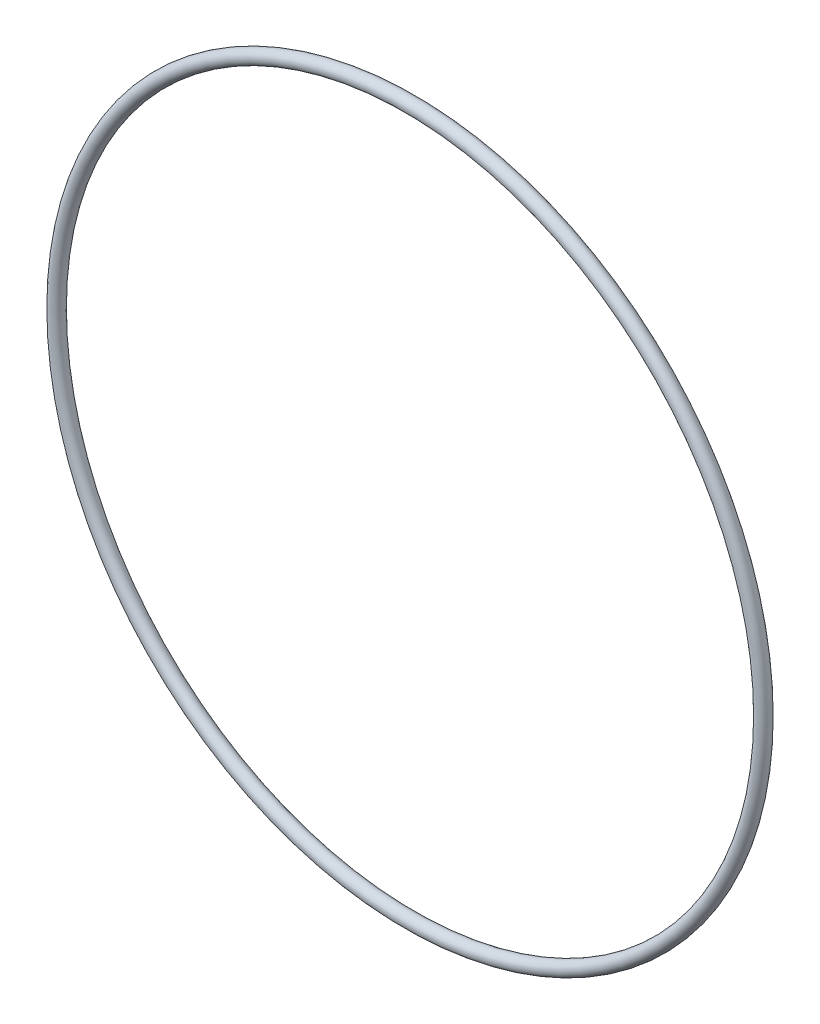
ISO-10303-21;
HEADER;
FILE_DESCRIPTION(('STEP AP214'),'2;1');
FILE_NAME('part.step','',(''),(''),'','','');
FILE_SCHEMA(('AUTOMOTIVE_DESIGN { 1 0 10303 214 1 1 1 1 }'));
ENDSEC;
DATA;
#1=APPLICATION_CONTEXT('core data for automotive mechanical design processes');
#2=APPLICATION_PROTOCOL_DEFINITION('international standard','automotive_design',2000,#1);
#3=PRODUCT_CONTEXT('',#1,'mechanical');
#4=PRODUCT('Part','Part','',(#3));
#5=PRODUCT_RELATED_PRODUCT_CATEGORY('part','',(#4));
#6=PRODUCT_DEFINITION_FORMATION('','',#4);
#7=PRODUCT_DEFINITION_CONTEXT('part definition',#1,'design');
#8=PRODUCT_DEFINITION('design','',#6,#7);
#9=PRODUCT_DEFINITION_SHAPE('','',#8);
#10=(LENGTH_UNIT() NAMED_UNIT(*) SI_UNIT(.MILLI.,.METRE.));
#11=(NAMED_UNIT(*) PLANE_ANGLE_UNIT() SI_UNIT($,.RADIAN.));
#12=(NAMED_UNIT(*) SI_UNIT($,.STERADIAN.) SOLID_ANGLE_UNIT());
#13=UNCERTAINTY_MEASURE_WITH_UNIT(LENGTH_MEASURE(1.E-05),#10,'distance_accuracy_value','');
#14=(GEOMETRIC_REPRESENTATION_CONTEXT(3) GLOBAL_UNCERTAINTY_ASSIGNED_CONTEXT((#13)) GLOBAL_UNIT_ASSIGNED_CONTEXT((#10,
#11,#12)) REPRESENTATION_CONTEXT('',''));
#15=CARTESIAN_POINT('',(0.,0.,0.));
#16=DIRECTION('',(0.,0.,1.));
#17=DIRECTION('',(1.,0.,0.));
#18=AXIS2_PLACEMENT_3D('',#15,#16,#17);
#19=CARTESIAN_POINT('',(0.,0.,0.));
#20=DIRECTION('',(0.,0.,-1.));
#21=DIRECTION('',(-1.,0.,0.));
#22=AXIS2_PLACEMENT_3D('',#19,#20,#21);
#23=TOROIDAL_SURFACE('',#22,76.5,1.5);
#24=CARTESIAN_POINT('',(-78.,0.,0.));
#25=VERTEX_POINT('',#24);
#26=VERTEX_LOOP('',#25);
#27=FACE_BOUND('',#26,.T.);
#28=ADVANCED_FACE('F41',(#27),#23,.T.);
#29=CLOSED_SHELL('',(#28));
#30=MANIFOLD_SOLID_BREP('B2',#29);
#31=ADVANCED_BREP_SHAPE_REPRESENTATION('',(#18,#30),#14);
#32=SHAPE_DEFINITION_REPRESENTATION(#9,#31);
ENDSEC;
END-ISO-10303-21;
